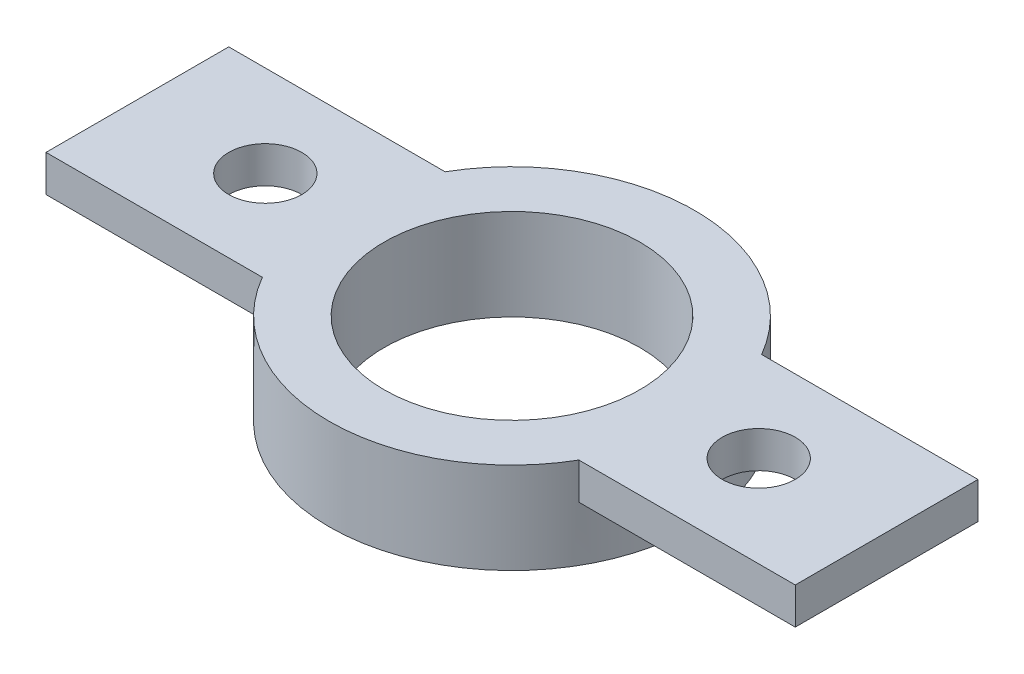
ISO-10303-21;
HEADER;
FILE_DESCRIPTION(('STEP AP214'),'2;1');
FILE_NAME('part.step','',(''),(''),'','','');
FILE_SCHEMA(('AUTOMOTIVE_DESIGN { 1 0 10303 214 1 1 1 1 }'));
ENDSEC;
DATA;
#1=APPLICATION_CONTEXT('core data for automotive mechanical design processes');
#2=APPLICATION_PROTOCOL_DEFINITION('international standard','automotive_design',2000,#1);
#3=PRODUCT_CONTEXT('',#1,'mechanical');
#4=PRODUCT('Part','Part','',(#3));
#5=PRODUCT_RELATED_PRODUCT_CATEGORY('part','',(#4));
#6=PRODUCT_DEFINITION_FORMATION('','',#4);
#7=PRODUCT_DEFINITION_CONTEXT('part definition',#1,'design');
#8=PRODUCT_DEFINITION('design','',#6,#7);
#9=PRODUCT_DEFINITION_SHAPE('','',#8);
#10=(LENGTH_UNIT() NAMED_UNIT(*) SI_UNIT(.MILLI.,.METRE.));
#11=(NAMED_UNIT(*) PLANE_ANGLE_UNIT() SI_UNIT($,.RADIAN.));
#12=(NAMED_UNIT(*) SI_UNIT($,.STERADIAN.) SOLID_ANGLE_UNIT());
#13=UNCERTAINTY_MEASURE_WITH_UNIT(LENGTH_MEASURE(1.E-05),#10,'distance_accuracy_value','');
#14=(GEOMETRIC_REPRESENTATION_CONTEXT(3) GLOBAL_UNCERTAINTY_ASSIGNED_CONTEXT((#13)) GLOBAL_UNIT_ASSIGNED_CONTEXT((#10,
#11,#12)) REPRESENTATION_CONTEXT('',''));
#15=CARTESIAN_POINT('',(0.,0.,0.));
#16=DIRECTION('',(0.,0.,1.));
#17=DIRECTION('',(1.,0.,0.));
#18=AXIS2_PLACEMENT_3D('',#15,#16,#17);
#19=CARTESIAN_POINT('',(0.,2.,0.));
#20=DIRECTION('',(0.,0.,-1.));
#21=DIRECTION('',(-1.,0.,0.));
#22=AXIS2_PLACEMENT_3D('',#19,#20,#21);
#23=PLANE('',#22);
#24=DIRECTION('',(1.,0.,0.));
#25=VECTOR('',#24,1.);
#26=CARTESIAN_POINT('',(0.,0.,0.));
#27=LINE('',#26,#25);
#28=CARTESIAN_POINT('',(-3.,0.,0.));
#29=VERTEX_POINT('',#28);
#30=CARTESIAN_POINT('',(8.83974596215561,0.,0.));
#31=VERTEX_POINT('',#30);
#32=EDGE_CURVE('E109',#29,#31,#27,.T.);
#33=ORIENTED_EDGE('',*,*,#32,.T.);
#34=DIRECTION('',(0.,1.,0.));
#35=VECTOR('',#34,1.);
#36=CARTESIAN_POINT('',(8.83974596215561,-3.,0.));
#37=LINE('',#36,#35);
#38=CARTESIAN_POINT('',(8.83974596215561,2.,0.));
#39=VERTEX_POINT('',#38);
#40=EDGE_CURVE('E162',#31,#39,#37,.T.);
#41=ORIENTED_EDGE('',*,*,#40,.T.);
#42=DIRECTION('',(1.,0.,0.));
#43=VECTOR('',#42,1.);
#44=CARTESIAN_POINT('',(0.,2.,0.));
#45=LINE('',#44,#43);
#46=CARTESIAN_POINT('',(-3.,2.,0.));
#47=VERTEX_POINT('',#46);
#48=EDGE_CURVE('E166',#47,#39,#45,.T.);
#49=ORIENTED_EDGE('',*,*,#48,.F.);
#50=DIRECTION('',(0.,1.,0.));
#51=VECTOR('',#50,1.);
#52=CARTESIAN_POINT('',(-3.,2.,0.));
#53=LINE('',#52,#51);
#54=EDGE_CURVE('E128',#29,#47,#53,.T.);
#55=ORIENTED_EDGE('',*,*,#54,.F.);
#56=EDGE_LOOP('',(#33,#41,#49,#55));
#57=FACE_BOUND('',#56,.T.);
#58=ADVANCED_FACE('F33',(#57),#23,.F.);
#59=CARTESIAN_POINT('',(0.,2.,-10.));
#60=DIRECTION('',(0.,0.,1.));
#61=DIRECTION('',(1.,0.,0.));
#62=AXIS2_PLACEMENT_3D('',#59,#60,#61);
#63=PLANE('',#62);
#64=DIRECTION('',(-1.,0.,0.));
#65=VECTOR('',#64,1.);
#66=CARTESIAN_POINT('',(0.,0.,-10.));
#67=LINE('',#66,#65);
#68=CARTESIAN_POINT('',(38.,0.,-10.));
#69=VERTEX_POINT('',#68);
#70=CARTESIAN_POINT('',(26.1602540378444,0.,-10.));
#71=VERTEX_POINT('',#70);
#72=EDGE_CURVE('E114',#69,#71,#67,.T.);
#73=ORIENTED_EDGE('',*,*,#72,.T.);
#74=DIRECTION('',(0.,1.,0.));
#75=VECTOR('',#74,1.);
#76=CARTESIAN_POINT('',(26.1602540378444,-3.,-10.));
#77=LINE('',#76,#75);
#78=CARTESIAN_POINT('',(26.1602540378444,2.,-10.));
#79=VERTEX_POINT('',#78);
#80=EDGE_CURVE('E58',#71,#79,#77,.T.);
#81=ORIENTED_EDGE('',*,*,#80,.T.);
#82=DIRECTION('',(-1.,0.,0.));
#83=VECTOR('',#82,1.);
#84=CARTESIAN_POINT('',(0.,2.,-10.));
#85=LINE('',#84,#83);
#86=CARTESIAN_POINT('',(38.,2.,-10.));
#87=VERTEX_POINT('',#86);
#88=EDGE_CURVE('E170',#87,#79,#85,.T.);
#89=ORIENTED_EDGE('',*,*,#88,.F.);
#90=DIRECTION('',(0.,1.,0.));
#91=VECTOR('',#90,1.);
#92=CARTESIAN_POINT('',(38.,0.,-10.));
#93=LINE('',#92,#91);
#94=EDGE_CURVE('E118',#69,#87,#93,.T.);
#95=ORIENTED_EDGE('',*,*,#94,.F.);
#96=EDGE_LOOP('',(#73,#81,#89,#95));
#97=FACE_BOUND('',#96,.T.);
#98=ADVANCED_FACE('F197',(#97),#63,.F.);
#99=CARTESIAN_POINT('',(0.,0.,0.));
#100=DIRECTION('',(0.,-1.,0.));
#101=DIRECTION('',(0.,0.,-1.));
#102=AXIS2_PLACEMENT_3D('',#99,#100,#101);
#103=PLANE('',#102);
#104=CARTESIAN_POINT('',(31.,0.,-5.));
#105=DIRECTION('',(0.,-1.,0.));
#106=DIRECTION('',(0.,0.,-1.));
#107=AXIS2_PLACEMENT_3D('',#104,#105,#106);
#108=CIRCLE('',#107,2.00000000000001);
#109=CARTESIAN_POINT('',(31.,0.,-7.00000000000001));
#110=VERTEX_POINT('',#109);
#111=EDGE_CURVE('E140',#110,#110,#108,.T.);
#112=ORIENTED_EDGE('',*,*,#111,.F.);
#113=EDGE_LOOP('',(#112));
#114=FACE_BOUND('',#113,.T.);
#115=CARTESIAN_POINT('',(17.5,0.,-5.));
#116=DIRECTION('',(0.,-1.,0.));
#117=DIRECTION('',(0.,0.,-1.));
#118=AXIS2_PLACEMENT_3D('',#115,#116,#117);
#119=CIRCLE('',#118,10.);
#120=CARTESIAN_POINT('',(26.1602540378444,0.,0.));
#121=VERTEX_POINT('',#120);
#122=EDGE_CURVE('E11',#71,#121,#119,.T.);
#123=ORIENTED_EDGE('',*,*,#122,.F.);
#124=ORIENTED_EDGE('',*,*,#72,.F.);
#125=DIRECTION('',(0.,0.,-1.));
#126=VECTOR('',#125,1.);
#127=CARTESIAN_POINT('',(38.,0.,0.));
#128=LINE('',#127,#126);
#129=CARTESIAN_POINT('',(38.,0.,0.));
#130=VERTEX_POINT('',#129);
#131=EDGE_CURVE('E112',#130,#69,#128,.T.);
#132=ORIENTED_EDGE('',*,*,#131,.F.);
#133=EDGE_CURVE('E102',#121,#130,#27,.T.);
#134=ORIENTED_EDGE('',*,*,#133,.F.);
#135=EDGE_LOOP('',(#123,#124,#132,#134));
#136=FACE_BOUND('',#135,.T.);
#137=ADVANCED_FACE('F113',(#114,#136),#103,.T.);
#138=CARTESIAN_POINT('',(26.1602540378444,2.,0.));
#139=VERTEX_POINT('',#138);
#140=CARTESIAN_POINT('',(38.,2.,0.));
#141=VERTEX_POINT('',#140);
#142=EDGE_CURVE('E169',#139,#141,#45,.T.);
#143=ORIENTED_EDGE('',*,*,#142,.F.);
#144=DIRECTION('',(0.,1.,0.));
#145=VECTOR('',#144,1.);
#146=CARTESIAN_POINT('',(26.1602540378444,-3.,0.));
#147=LINE('',#146,#145);
#148=EDGE_CURVE('E107',#139,#121,#147,.F.);
#149=ORIENTED_EDGE('',*,*,#148,.T.);
#150=ORIENTED_EDGE('',*,*,#133,.T.);
#151=DIRECTION('',(0.,-1.,0.));
#152=VECTOR('',#151,1.);
#153=CARTESIAN_POINT('',(38.,0.,0.));
#154=LINE('',#153,#152);
#155=EDGE_CURVE('E105',#141,#130,#154,.T.);
#156=ORIENTED_EDGE('',*,*,#155,.F.);
#157=EDGE_LOOP('',(#143,#149,#150,#156));
#158=FACE_BOUND('',#157,.T.);
#159=ADVANCED_FACE('F35',(#158),#23,.F.);
#160=CARTESIAN_POINT('',(8.83974596215561,2.,-10.));
#161=VERTEX_POINT('',#160);
#162=CARTESIAN_POINT('',(-3.,2.,-10.));
#163=VERTEX_POINT('',#162);
#164=EDGE_CURVE('E50',#161,#163,#85,.T.);
#165=ORIENTED_EDGE('',*,*,#164,.F.);
#166=DIRECTION('',(0.,1.,0.));
#167=VECTOR('',#166,1.);
#168=CARTESIAN_POINT('',(8.83974596215561,-3.,-10.));
#169=LINE('',#168,#167);
#170=CARTESIAN_POINT('',(8.83974596215561,0.,-10.));
#171=VERTEX_POINT('',#170);
#172=EDGE_CURVE('E156',#161,#171,#169,.F.);
#173=ORIENTED_EDGE('',*,*,#172,.T.);
#174=CARTESIAN_POINT('',(-3.,0.,-10.));
#175=VERTEX_POINT('',#174);
#176=EDGE_CURVE('E173',#171,#175,#67,.T.);
#177=ORIENTED_EDGE('',*,*,#176,.T.);
#178=DIRECTION('',(0.,-1.,0.));
#179=VECTOR('',#178,1.);
#180=CARTESIAN_POINT('',(-3.,2.,-10.));
#181=LINE('',#180,#179);
#182=EDGE_CURVE('E134',#163,#175,#181,.T.);
#183=ORIENTED_EDGE('',*,*,#182,.F.);
#184=EDGE_LOOP('',(#165,#173,#177,#183));
#185=FACE_BOUND('',#184,.T.);
#186=ADVANCED_FACE('F202',(#185),#63,.F.);
#187=CARTESIAN_POINT('',(0.,2.,0.));
#188=DIRECTION('',(0.,-1.,0.));
#189=DIRECTION('',(0.,0.,-1.));
#190=AXIS2_PLACEMENT_3D('',#187,#188,#189);
#191=PLANE('',#190);
#192=CARTESIAN_POINT('',(4.,2.,-5.));
#193=DIRECTION('',(0.,-1.,0.));
#194=DIRECTION('',(0.,0.,-1.));
#195=AXIS2_PLACEMENT_3D('',#192,#193,#194);
#196=CIRCLE('',#195,2.);
#197=CARTESIAN_POINT('',(4.,2.,-7.));
#198=VERTEX_POINT('',#197);
#199=EDGE_CURVE('E144',#198,#198,#196,.T.);
#200=ORIENTED_EDGE('',*,*,#199,.T.);
#201=EDGE_LOOP('',(#200));
#202=FACE_BOUND('',#201,.T.);
#203=CARTESIAN_POINT('',(31.,2.,-5.));
#204=DIRECTION('',(0.,-1.,0.));
#205=DIRECTION('',(0.,0.,-1.));
#206=AXIS2_PLACEMENT_3D('',#203,#204,#205);
#207=CIRCLE('',#206,2.00000000000001);
#208=CARTESIAN_POINT('',(31.,2.,-7.00000000000001));
#209=VERTEX_POINT('',#208);
#210=EDGE_CURVE('E37',#209,#209,#207,.T.);
#211=ORIENTED_EDGE('',*,*,#210,.T.);
#212=EDGE_LOOP('',(#211));
#213=FACE_BOUND('',#212,.T.);
#214=CARTESIAN_POINT('',(17.5,2.,-5.));
#215=DIRECTION('',(0.,1.,0.));
#216=DIRECTION('',(0.,0.,1.));
#217=AXIS2_PLACEMENT_3D('',#214,#215,#216);
#218=CIRCLE('',#217,7.);
#219=CARTESIAN_POINT('',(17.5,2.,2.));
#220=VERTEX_POINT('',#219);
#221=EDGE_CURVE('E149',#220,#220,#218,.T.);
#222=ORIENTED_EDGE('',*,*,#221,.F.);
#223=EDGE_LOOP('',(#222));
#224=FACE_BOUND('',#223,.T.);
#225=ORIENTED_EDGE('',*,*,#48,.T.);
#226=CARTESIAN_POINT('',(17.5,2.,-5.));
#227=DIRECTION('',(0.,1.,0.));
#228=DIRECTION('',(0.,0.,1.));
#229=AXIS2_PLACEMENT_3D('',#226,#227,#228);
#230=CIRCLE('',#229,10.);
#231=EDGE_CURVE('E158',#39,#139,#230,.T.);
#232=ORIENTED_EDGE('',*,*,#231,.T.);
#233=ORIENTED_EDGE('',*,*,#142,.T.);
#234=DIRECTION('',(0.,0.,1.));
#235=VECTOR('',#234,1.);
#236=CARTESIAN_POINT('',(38.,2.,0.));
#237=LINE('',#236,#235);
#238=EDGE_CURVE('E123',#87,#141,#237,.T.);
#239=ORIENTED_EDGE('',*,*,#238,.F.);
#240=ORIENTED_EDGE('',*,*,#88,.T.);
#241=EDGE_CURVE('E157',#79,#161,#230,.T.);
#242=ORIENTED_EDGE('',*,*,#241,.T.);
#243=ORIENTED_EDGE('',*,*,#164,.T.);
#244=DIRECTION('',(0.,0.,-1.));
#245=VECTOR('',#244,1.);
#246=CARTESIAN_POINT('',(-3.,2.,0.));
#247=LINE('',#246,#245);
#248=EDGE_CURVE('E131',#47,#163,#247,.T.);
#249=ORIENTED_EDGE('',*,*,#248,.F.);
#250=EDGE_LOOP('',(#225,#232,#233,#239,#240,#242,#243,#249));
#251=FACE_BOUND('',#250,.T.);
#252=ADVANCED_FACE('F208',(#202,#213,#224,#251),#191,.F.);
#253=CARTESIAN_POINT('',(4.,0.,-5.));
#254=DIRECTION('',(0.,-1.,0.));
#255=DIRECTION('',(0.,0.,-1.));
#256=AXIS2_PLACEMENT_3D('',#253,#254,#255);
#257=CIRCLE('',#256,2.);
#258=CARTESIAN_POINT('',(4.,0.,-7.));
#259=VERTEX_POINT('',#258);
#260=EDGE_CURVE('E141',#259,#259,#257,.T.);
#261=ORIENTED_EDGE('',*,*,#260,.F.);
#262=EDGE_LOOP('',(#261));
#263=FACE_BOUND('',#262,.T.);
#264=EDGE_CURVE('E42',#31,#171,#119,.T.);
#265=ORIENTED_EDGE('',*,*,#264,.F.);
#266=ORIENTED_EDGE('',*,*,#32,.F.);
#267=DIRECTION('',(0.,0.,1.));
#268=VECTOR('',#267,1.);
#269=CARTESIAN_POINT('',(-3.,0.,0.));
#270=LINE('',#269,#268);
#271=EDGE_CURVE('E137',#175,#29,#270,.T.);
#272=ORIENTED_EDGE('',*,*,#271,.F.);
#273=ORIENTED_EDGE('',*,*,#176,.F.);
#274=EDGE_LOOP('',(#265,#266,#272,#273));
#275=FACE_BOUND('',#274,.T.);
#276=ADVANCED_FACE('F211',(#263,#275),#103,.T.);
#277=CARTESIAN_POINT('',(17.5,-3.,-5.));
#278=DIRECTION('',(0.,1.,0.));
#279=DIRECTION('',(0.,0.,1.));
#280=AXIS2_PLACEMENT_3D('',#277,#278,#279);
#281=CYLINDRICAL_SURFACE('',#280,10.);
#282=CARTESIAN_POINT('',(17.5,-3.,-5.));
#283=DIRECTION('',(0.,1.,0.));
#284=DIRECTION('',(0.,0.,1.));
#285=AXIS2_PLACEMENT_3D('',#282,#283,#284);
#286=CIRCLE('',#285,10.);
#287=CARTESIAN_POINT('',(17.5,-3.,5.));
#288=VERTEX_POINT('',#287);
#289=EDGE_CURVE('E153',#288,#288,#286,.T.);
#290=ORIENTED_EDGE('',*,*,#289,.T.);
#291=EDGE_LOOP('',(#290));
#292=FACE_BOUND('',#291,.T.);
#293=ORIENTED_EDGE('',*,*,#148,.F.);
#294=ORIENTED_EDGE('',*,*,#231,.F.);
#295=ORIENTED_EDGE('',*,*,#40,.F.);
#296=ORIENTED_EDGE('',*,*,#264,.T.);
#297=ORIENTED_EDGE('',*,*,#172,.F.);
#298=ORIENTED_EDGE('',*,*,#241,.F.);
#299=ORIENTED_EDGE('',*,*,#80,.F.);
#300=ORIENTED_EDGE('',*,*,#122,.T.);
#301=EDGE_LOOP('',(#293,#294,#295,#296,#297,#298,#299,#300));
#302=FACE_BOUND('',#301,.T.);
#303=ADVANCED_FACE('F193',(#292,#302),#281,.T.);
#304=CARTESIAN_POINT('',(17.5,-3.,-5.));
#305=DIRECTION('',(0.,1.,0.));
#306=DIRECTION('',(0.,0.,1.));
#307=AXIS2_PLACEMENT_3D('',#304,#305,#306);
#308=PLANE('',#307);
#309=CARTESIAN_POINT('',(17.5,-2.99999999999989,-5.));
#310=DIRECTION('',(0.,1.,0.));
#311=DIRECTION('',(0.,0.,1.));
#312=AXIS2_PLACEMENT_3D('',#309,#310,#311);
#313=CIRCLE('',#312,7.);
#314=CARTESIAN_POINT('',(17.5,-2.99999999999989,2.));
#315=VERTEX_POINT('',#314);
#316=EDGE_CURVE('E152',#315,#315,#313,.T.);
#317=ORIENTED_EDGE('',*,*,#316,.T.);
#318=EDGE_LOOP('',(#317));
#319=FACE_BOUND('',#318,.T.);
#320=ORIENTED_EDGE('',*,*,#289,.F.);
#321=EDGE_LOOP('',(#320));
#322=FACE_BOUND('',#321,.T.);
#323=ADVANCED_FACE('F178',(#319,#322),#308,.F.);
#324=CARTESIAN_POINT('',(17.5,-1998.,-5.));
#325=DIRECTION('',(0.,1.,0.));
#326=DIRECTION('',(0.,0.,1.));
#327=AXIS2_PLACEMENT_3D('',#324,#325,#326);
#328=CYLINDRICAL_SURFACE('',#327,7.);
#329=ORIENTED_EDGE('',*,*,#221,.T.);
#330=EDGE_LOOP('',(#329));
#331=FACE_BOUND('',#330,.T.);
#332=ORIENTED_EDGE('',*,*,#316,.F.);
#333=EDGE_LOOP('',(#332));
#334=FACE_BOUND('',#333,.T.);
#335=ADVANCED_FACE('F181',(#331,#334),#328,.F.);
#336=CARTESIAN_POINT('',(4.,20.,-5.));
#337=DIRECTION('',(0.,-1.,0.));
#338=DIRECTION('',(0.,0.,-1.));
#339=AXIS2_PLACEMENT_3D('',#336,#337,#338);
#340=CYLINDRICAL_SURFACE('',#339,2.);
#341=ORIENTED_EDGE('',*,*,#260,.T.);
#342=EDGE_LOOP('',(#341));
#343=FACE_BOUND('',#342,.T.);
#344=ORIENTED_EDGE('',*,*,#199,.F.);
#345=EDGE_LOOP('',(#344));
#346=FACE_BOUND('',#345,.T.);
#347=ADVANCED_FACE('F183',(#343,#346),#340,.F.);
#348=CARTESIAN_POINT('',(31.,20.,-5.));
#349=DIRECTION('',(0.,-1.,0.));
#350=DIRECTION('',(0.,0.,-1.));
#351=AXIS2_PLACEMENT_3D('',#348,#349,#350);
#352=CYLINDRICAL_SURFACE('',#351,2.00000000000001);
#353=ORIENTED_EDGE('',*,*,#111,.T.);
#354=EDGE_LOOP('',(#353));
#355=FACE_BOUND('',#354,.T.);
#356=ORIENTED_EDGE('',*,*,#210,.F.);
#357=EDGE_LOOP('',(#356));
#358=FACE_BOUND('',#357,.T.);
#359=ADVANCED_FACE('F190',(#355,#358),#352,.F.);
#360=CARTESIAN_POINT('',(-3.,0.,0.));
#361=DIRECTION('',(1.,0.,0.));
#362=DIRECTION('',(0.,0.,-1.));
#363=AXIS2_PLACEMENT_3D('',#360,#361,#362);
#364=PLANE('',#363);
#365=ORIENTED_EDGE('',*,*,#54,.T.);
#366=ORIENTED_EDGE('',*,*,#248,.T.);
#367=ORIENTED_EDGE('',*,*,#182,.T.);
#368=ORIENTED_EDGE('',*,*,#271,.T.);
#369=EDGE_LOOP('',(#365,#366,#367,#368));
#370=FACE_BOUND('',#369,.T.);
#371=ADVANCED_FACE('F236',(#370),#364,.F.);
#372=CARTESIAN_POINT('',(38.,0.,0.));
#373=DIRECTION('',(-1.,0.,0.));
#374=DIRECTION('',(0.,0.,1.));
#375=AXIS2_PLACEMENT_3D('',#372,#373,#374);
#376=PLANE('',#375);
#377=ORIENTED_EDGE('',*,*,#155,.T.);
#378=ORIENTED_EDGE('',*,*,#131,.T.);
#379=ORIENTED_EDGE('',*,*,#94,.T.);
#380=ORIENTED_EDGE('',*,*,#238,.T.);
#381=EDGE_LOOP('',(#377,#378,#379,#380));
#382=FACE_BOUND('',#381,.T.);
#383=ADVANCED_FACE('F121',(#382),#376,.F.);
#384=CLOSED_SHELL('',(#58,#98,#137,#159,#186,#252,#276,#303,#323,#335,#347,#359,#371,#383));
#385=MANIFOLD_SOLID_BREP('B2',#384);
#386=ADVANCED_BREP_SHAPE_REPRESENTATION('',(#18,#385),#14);
#387=SHAPE_DEFINITION_REPRESENTATION(#9,#386);
ENDSEC;
END-ISO-10303-21;
